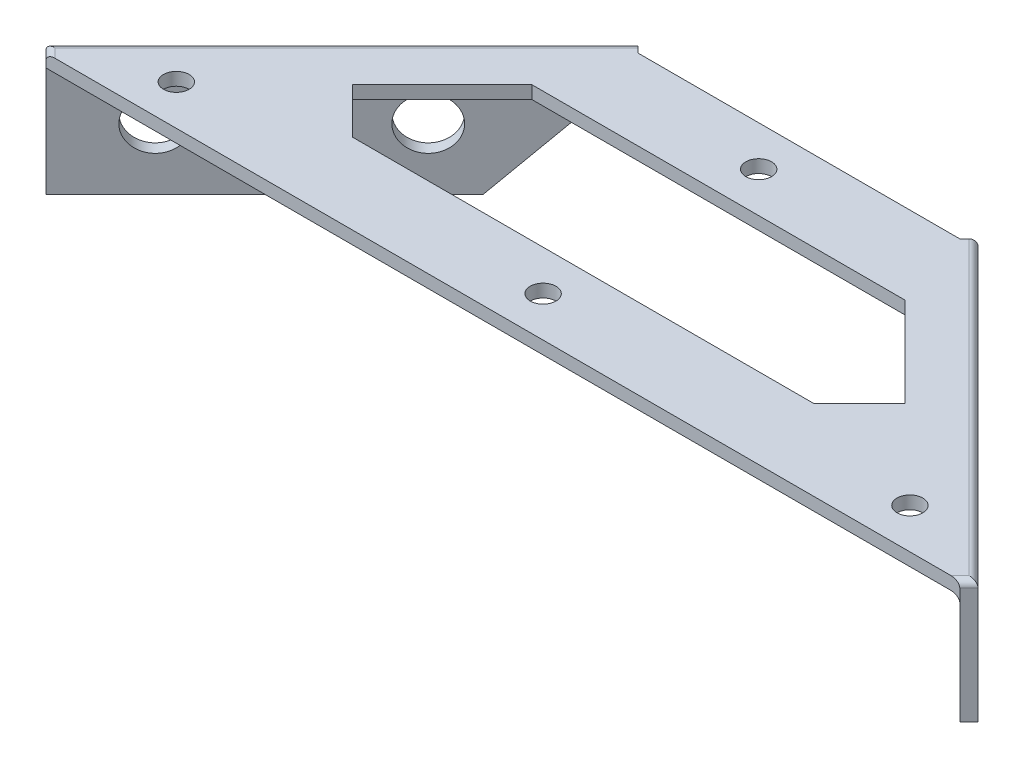
ISO-10303-21;
HEADER;
FILE_DESCRIPTION(('STEP AP214'),'2;1');
FILE_NAME('part.step','',(''),(''),'','','');
FILE_SCHEMA(('AUTOMOTIVE_DESIGN { 1 0 10303 214 1 1 1 1 }'));
ENDSEC;
DATA;
#1=APPLICATION_CONTEXT('core data for automotive mechanical design processes');
#2=APPLICATION_PROTOCOL_DEFINITION('international standard','automotive_design',2000,#1);
#3=PRODUCT_CONTEXT('',#1,'mechanical');
#4=PRODUCT('Part','Part','',(#3));
#5=PRODUCT_RELATED_PRODUCT_CATEGORY('part','',(#4));
#6=PRODUCT_DEFINITION_FORMATION('','',#4);
#7=PRODUCT_DEFINITION_CONTEXT('part definition',#1,'design');
#8=PRODUCT_DEFINITION('design','',#6,#7);
#9=PRODUCT_DEFINITION_SHAPE('','',#8);
#10=(LENGTH_UNIT() NAMED_UNIT(*) SI_UNIT(.MILLI.,.METRE.));
#11=(NAMED_UNIT(*) PLANE_ANGLE_UNIT() SI_UNIT($,.RADIAN.));
#12=(NAMED_UNIT(*) SI_UNIT($,.STERADIAN.) SOLID_ANGLE_UNIT());
#13=UNCERTAINTY_MEASURE_WITH_UNIT(LENGTH_MEASURE(1.E-05),#10,'distance_accuracy_value','');
#14=(GEOMETRIC_REPRESENTATION_CONTEXT(3) GLOBAL_UNCERTAINTY_ASSIGNED_CONTEXT((#13)) GLOBAL_UNIT_ASSIGNED_CONTEXT((#10,
#11,#12)) REPRESENTATION_CONTEXT('',''));
#15=CARTESIAN_POINT('',(0.,0.,0.));
#16=DIRECTION('',(0.,0.,1.));
#17=DIRECTION('',(1.,0.,0.));
#18=AXIS2_PLACEMENT_3D('',#15,#16,#17);
#19=CARTESIAN_POINT('',(24.9999999999995,69.0538238691627,-46.));
#20=DIRECTION('',(-0.707106781186551,0.,-0.707106781186544));
#21=DIRECTION('',(-0.707106781186544,0.,0.707106781186551));
#22=AXIS2_PLACEMENT_3D('',#19,#20,#21);
#23=PLANE('',#22);
#24=DIRECTION('',(0.,-1.,0.));
#25=VECTOR('',#24,1.);
#26=CARTESIAN_POINT('',(26.4142135623726,69.0538238691627,-47.4142135623731));
#27=LINE('',#26,#25);
#28=CARTESIAN_POINT('',(26.4142135623726,1.,-47.4142135623731));
#29=VERTEX_POINT('',#28);
#30=CARTESIAN_POINT('',(26.4142135623726,0.,-47.4142135623731));
#31=VERTEX_POINT('',#30);
#32=EDGE_CURVE('E212',#29,#31,#27,.T.);
#33=ORIENTED_EDGE('',*,*,#32,.T.);
#34=DIRECTION('',(-0.707106781186544,0.,0.707106781186551));
#35=VECTOR('',#34,1.);
#36=CARTESIAN_POINT('',(49.4142135623726,0.,-70.4142135623733));
#37=LINE('',#36,#35);
#38=CARTESIAN_POINT('',(24.9999999999995,0.,-46.));
#39=VERTEX_POINT('',#38);
#40=EDGE_CURVE('E196',#31,#39,#37,.T.);
#41=ORIENTED_EDGE('',*,*,#40,.T.);
#42=DIRECTION('',(0.,-1.,0.));
#43=VECTOR('',#42,1.);
#44=CARTESIAN_POINT('',(24.9999999999995,2.,-46.));
#45=LINE('',#44,#43);
#46=CARTESIAN_POINT('',(24.9999999999995,2.,-46.));
#47=VERTEX_POINT('',#46);
#48=EDGE_CURVE('E265',#47,#39,#45,.T.);
#49=ORIENTED_EDGE('',*,*,#48,.F.);
#50=DIRECTION('',(-0.707106781186544,0.,0.707106781186551));
#51=VECTOR('',#50,1.);
#52=CARTESIAN_POINT('',(24.9999999999995,2.,-46.));
#53=LINE('',#52,#51);
#54=CARTESIAN_POINT('',(25.7071067811861,2.,-46.7071067811865));
#55=VERTEX_POINT('',#54);
#56=EDGE_CURVE('E221',#55,#47,#53,.T.);
#57=ORIENTED_EDGE('',*,*,#56,.F.);
#58=CARTESIAN_POINT('',(25.7071067811861,1.,-46.7071067811866));
#59=DIRECTION('',(-0.707106781186551,0.,-0.707106781186544));
#60=DIRECTION('',(-0.707106781186544,0.,0.707106781186551));
#61=AXIS2_PLACEMENT_3D('',#58,#59,#60);
#62=CIRCLE('',#61,1.);
#63=EDGE_CURVE('E303',#55,#29,#62,.T.);
#64=ORIENTED_EDGE('',*,*,#63,.T.);
#65=EDGE_LOOP('',(#33,#41,#49,#57,#64));
#66=FACE_BOUND('',#65,.T.);
#67=ADVANCED_FACE('F37',(#66),#23,.T.);
#68=CARTESIAN_POINT('',(24.9999999999995,69.0538238691627,-46.));
#69=DIRECTION('',(-0.707106781186544,0.,0.707106781186551));
#70=DIRECTION('',(0.707106781186551,0.,0.707106781186544));
#71=AXIS2_PLACEMENT_3D('',#68,#69,#70);
#72=PLANE('',#71);
#73=CARTESIAN_POINT('',(41.3015151901648,-7.50000000000001,-29.6984848098348));
#74=DIRECTION('',(-0.707106781186544,0.,0.707106781186551));
#75=DIRECTION('',(0.707106781186551,0.,0.707106781186544));
#76=AXIS2_PLACEMENT_3D('',#73,#74,#75);
#77=CIRCLE('',#76,4.);
#78=CARTESIAN_POINT('',(44.129942314911,-7.50000000000001,-26.8700576850887));
#79=VERTEX_POINT('',#78);
#80=EDGE_CURVE('E375',#79,#79,#77,.F.);
#81=ORIENTED_EDGE('',*,*,#80,.T.);
#82=EDGE_LOOP('',(#81));
#83=FACE_BOUND('',#82,.T.);
#84=CARTESIAN_POINT('',(62.5147186257614,-7.5,-8.48528137423854));
#85=DIRECTION('',(-0.707106781186544,0.,0.707106781186551));
#86=DIRECTION('',(0.707106781186551,0.,0.707106781186544));
#87=AXIS2_PLACEMENT_3D('',#84,#85,#86);
#88=CIRCLE('',#87,4.);
#89=CARTESIAN_POINT('',(65.3431457505076,-7.5,-5.65685424949236));
#90=VERTEX_POINT('',#89);
#91=EDGE_CURVE('E372',#90,#90,#88,.F.);
#92=ORIENTED_EDGE('',*,*,#91,.T.);
#93=EDGE_LOOP('',(#92));
#94=FACE_BOUND('',#93,.T.);
#95=DIRECTION('',(-0.707106781186551,0.,-0.707106781186544));
#96=VECTOR('',#95,1.);
#97=CARTESIAN_POINT('',(24.9999999999995,-1.,-46.));
#98=LINE('',#97,#96);
#99=CARTESIAN_POINT('',(71.,-1.,0.));
#100=VERTEX_POINT('',#99);
#101=CARTESIAN_POINT('',(25.7071067811861,-1.,-45.2928932188134));
#102=VERTEX_POINT('',#101);
#103=EDGE_CURVE('E205',#100,#102,#98,.T.);
#104=ORIENTED_EDGE('',*,*,#103,.T.);
#105=DIRECTION('',(0.500000000000005,-0.707106781186544,0.5));
#106=VECTOR('',#105,1.);
#107=CARTESIAN_POINT('',(24.9999999999995,0.,-46.));
#108=LINE('',#107,#106);
#109=CARTESIAN_POINT('',(37.020815280171,-17.,-33.9791847198287));
#110=VERTEX_POINT('',#109);
#111=EDGE_CURVE('E189',#102,#110,#108,.T.);
#112=ORIENTED_EDGE('',*,*,#111,.T.);
#113=DIRECTION('',(-0.707106781186551,0.,-0.707106781186544));
#114=VECTOR('',#113,1.);
#115=CARTESIAN_POINT('',(24.9999999999995,-17.,-46.));
#116=LINE('',#115,#114);
#117=CARTESIAN_POINT('',(71.,-17.,0.));
#118=VERTEX_POINT('',#117);
#119=EDGE_CURVE('E203',#118,#110,#116,.T.);
#120=ORIENTED_EDGE('',*,*,#119,.F.);
#121=DIRECTION('',(0.,-1.,0.));
#122=VECTOR('',#121,1.);
#123=CARTESIAN_POINT('',(71.,69.0538238691627,0.));
#124=LINE('',#123,#122);
#125=EDGE_CURVE('E224',#100,#118,#124,.T.);
#126=ORIENTED_EDGE('',*,*,#125,.F.);
#127=EDGE_LOOP('',(#104,#112,#120,#126));
#128=FACE_BOUND('',#127,.T.);
#129=ADVANCED_FACE('F201',(#83,#94,#128),#72,.T.);
#130=CARTESIAN_POINT('',(26.4142135623726,69.0538238691627,-47.4142135623731));
#131=DIRECTION('',(0.707106781186543,0.,-0.707106781186552));
#132=DIRECTION('',(-0.707106781186552,0.,-0.707106781186543));
#133=AXIS2_PLACEMENT_3D('',#130,#131,#132);
#134=PLANE('',#133);
#135=CARTESIAN_POINT('',(42.7157287525379,-7.50000000000001,-31.112698372208));
#136=DIRECTION('',(-0.707106781186544,0.,0.707106781186551));
#137=DIRECTION('',(0.707106781186551,0.,0.707106781186544));
#138=AXIS2_PLACEMENT_3D('',#135,#136,#137);
#139=CIRCLE('',#138,4.);
#140=CARTESIAN_POINT('',(45.5441558772841,-7.50000000000001,-28.2842712474618));
#141=VERTEX_POINT('',#140);
#142=EDGE_CURVE('E366',#141,#141,#139,.T.);
#143=ORIENTED_EDGE('',*,*,#142,.T.);
#144=EDGE_LOOP('',(#143));
#145=FACE_BOUND('',#144,.T.);
#146=CARTESIAN_POINT('',(63.9289321881345,-7.5,-9.89949493661166));
#147=DIRECTION('',(-0.707106781186544,0.,0.707106781186551));
#148=DIRECTION('',(0.707106781186551,0.,0.707106781186544));
#149=AXIS2_PLACEMENT_3D('',#146,#147,#148);
#150=CIRCLE('',#149,4.);
#151=CARTESIAN_POINT('',(66.7573593128807,-7.5,-7.07106781186549));
#152=VERTEX_POINT('',#151);
#153=EDGE_CURVE('E369',#152,#152,#150,.T.);
#154=ORIENTED_EDGE('',*,*,#153,.T.);
#155=EDGE_LOOP('',(#154));
#156=FACE_BOUND('',#155,.T.);
#157=DIRECTION('',(0.707106781186551,0.,0.707106781186543));
#158=VECTOR('',#157,1.);
#159=CARTESIAN_POINT('',(26.4142135623726,-17.,-47.4142135623731));
#160=LINE('',#159,#158);
#161=CARTESIAN_POINT('',(38.4350288425441,-17.,-35.3933982822017));
#162=VERTEX_POINT('',#161);
#163=CARTESIAN_POINT('',(72.4142135623731,-17.,-1.41421356237312));
#164=VERTEX_POINT('',#163);
#165=EDGE_CURVE('E217',#162,#164,#160,.T.);
#166=ORIENTED_EDGE('',*,*,#165,.F.);
#167=DIRECTION('',(-0.500000000000005,0.707106781186544,-0.5));
#168=VECTOR('',#167,1.);
#169=CARTESIAN_POINT('',(1.99999999999925,34.526911934581,-71.8284271247462));
#170=LINE('',#169,#168);
#171=EDGE_CURVE('E192',#162,#31,#170,.T.);
#172=ORIENTED_EDGE('',*,*,#171,.T.);
#173=ORIENTED_EDGE('',*,*,#32,.F.);
#174=DIRECTION('',(-0.707106781186552,0.,-0.707106781186543));
#175=VECTOR('',#174,1.);
#176=CARTESIAN_POINT('',(72.4142135623731,1.,-1.41421356237313));
#177=LINE('',#176,#175);
#178=CARTESIAN_POINT('',(72.4142135623731,1.,-1.41421356237312));
#179=VERTEX_POINT('',#178);
#180=EDGE_CURVE('E305',#29,#179,#177,.F.);
#181=ORIENTED_EDGE('',*,*,#180,.T.);
#182=DIRECTION('',(0.,-1.,0.));
#183=VECTOR('',#182,1.);
#184=CARTESIAN_POINT('',(72.4142135623731,69.0538238691627,-1.41421356237312));
#185=LINE('',#184,#183);
#186=EDGE_CURVE('E215',#179,#164,#185,.T.);
#187=ORIENTED_EDGE('',*,*,#186,.T.);
#188=EDGE_LOOP('',(#166,#172,#173,#181,#187));
#189=FACE_BOUND('',#188,.T.);
#190=ADVANCED_FACE('F334',(#145,#156,#189),#134,.T.);
#191=CARTESIAN_POINT('',(0.,-17.,0.));
#192=DIRECTION('',(0.,-1.,0.));
#193=DIRECTION('',(0.,0.,-1.));
#194=AXIS2_PLACEMENT_3D('',#191,#192,#193);
#195=PLANE('',#194);
#196=ORIENTED_EDGE('',*,*,#119,.T.);
#197=DIRECTION('',(-0.707106781186544,0.,0.707106781186551));
#198=VECTOR('',#197,1.);
#199=CARTESIAN_POINT('',(61.4350288425441,-17.,-58.393398282202));
#200=LINE('',#199,#198);
#201=EDGE_CURVE('E186',#162,#110,#200,.T.);
#202=ORIENTED_EDGE('',*,*,#201,.F.);
#203=ORIENTED_EDGE('',*,*,#165,.T.);
#204=DIRECTION('',(-0.707106781186557,0.,0.707106781186538));
#205=VECTOR('',#204,1.);
#206=CARTESIAN_POINT('',(71.,-17.,0.));
#207=LINE('',#206,#205);
#208=EDGE_CURVE('E211',#164,#118,#207,.T.);
#209=ORIENTED_EDGE('',*,*,#208,.T.);
#210=EDGE_LOOP('',(#196,#202,#203,#209));
#211=FACE_BOUND('',#210,.T.);
#212=ADVANCED_FACE('F209',(#211),#195,.T.);
#213=CARTESIAN_POINT('',(-71.,2.,0.));
#214=DIRECTION('',(0.,0.,-1.));
#215=DIRECTION('',(-1.,0.,0.));
#216=AXIS2_PLACEMENT_3D('',#213,#214,#215);
#217=PLANE('',#216);
#218=DIRECTION('',(0.,-1.,0.));
#219=VECTOR('',#218,1.);
#220=CARTESIAN_POINT('',(71.,2.,0.));
#221=LINE('',#220,#219);
#222=CARTESIAN_POINT('',(71.,1.,0.));
#223=VERTEX_POINT('',#222);
#224=EDGE_CURVE('E268',#223,#100,#221,.T.);
#225=ORIENTED_EDGE('',*,*,#224,.F.);
#226=CARTESIAN_POINT('',(69.5857864376268,1.,0.));
#227=DIRECTION('',(0.,0.,-1.));
#228=DIRECTION('',(-1.,0.,0.));
#229=AXIS2_PLACEMENT_3D('',#226,#227,#228);
#230=ELLIPSE('',#229,1.41421356237311,1.);
#231=CARTESIAN_POINT('',(69.5857864376268,2.,0.));
#232=VERTEX_POINT('',#231);
#233=EDGE_CURVE('E291',#223,#232,#230,.F.);
#234=ORIENTED_EDGE('',*,*,#233,.T.);
#235=DIRECTION('',(1.,0.,0.));
#236=VECTOR('',#235,1.);
#237=CARTESIAN_POINT('',(-71.,2.,0.));
#238=LINE('',#237,#236);
#239=CARTESIAN_POINT('',(-69.5857864376269,2.,0.));
#240=VERTEX_POINT('',#239);
#241=EDGE_CURVE('E247',#240,#232,#238,.T.);
#242=ORIENTED_EDGE('',*,*,#241,.F.);
#243=CARTESIAN_POINT('',(-69.5857864376269,1.,0.));
#244=DIRECTION('',(0.,0.,-1.));
#245=DIRECTION('',(-1.,0.,0.));
#246=AXIS2_PLACEMENT_3D('',#243,#244,#245);
#247=ELLIPSE('',#246,1.41421356237308,1.);
#248=CARTESIAN_POINT('',(-71.,1.,0.));
#249=VERTEX_POINT('',#248);
#250=EDGE_CURVE('E289',#240,#249,#247,.F.);
#251=ORIENTED_EDGE('',*,*,#250,.T.);
#252=DIRECTION('',(0.,-1.,0.));
#253=VECTOR('',#252,1.);
#254=CARTESIAN_POINT('',(-71.,2.,0.));
#255=LINE('',#254,#253);
#256=CARTESIAN_POINT('',(-71.,0.,0.));
#257=VERTEX_POINT('',#256);
#258=EDGE_CURVE('E253',#249,#257,#255,.T.);
#259=ORIENTED_EDGE('',*,*,#258,.T.);
#260=DIRECTION('',(1.,0.,0.));
#261=VECTOR('',#260,1.);
#262=CARTESIAN_POINT('',(-71.,0.,0.));
#263=LINE('',#262,#261);
#264=CARTESIAN_POINT('',(69.5857864376269,0.,0.));
#265=VERTEX_POINT('',#264);
#266=EDGE_CURVE('E239',#257,#265,#263,.T.);
#267=ORIENTED_EDGE('',*,*,#266,.T.);
#268=CARTESIAN_POINT('',(69.5857864376269,-1.,0.));
#269=DIRECTION('',(0.,0.,-1.));
#270=DIRECTION('',(1.,0.,0.));
#271=AXIS2_PLACEMENT_3D('',#268,#269,#270);
#272=ELLIPSE('',#271,1.4142135623731,1.);
#273=EDGE_CURVE('E45',#265,#100,#272,.T.);
#274=ORIENTED_EDGE('',*,*,#273,.T.);
#275=EDGE_LOOP('',(#225,#234,#242,#251,#259,#267,#274));
#276=FACE_BOUND('',#275,.T.);
#277=ADVANCED_FACE('F343',(#276),#217,.F.);
#278=CARTESIAN_POINT('',(24.9999999999995,2.,-46.));
#279=DIRECTION('',(0.,0.,1.));
#280=DIRECTION('',(1.,0.,0.));
#281=AXIS2_PLACEMENT_3D('',#278,#279,#280);
#282=PLANE('',#281);
#283=ORIENTED_EDGE('',*,*,#48,.T.);
#284=DIRECTION('',(0.,1.,0.));
#285=VECTOR('',#284,1.);
#286=CARTESIAN_POINT('',(24.9999999999995,-17.,-46.));
#287=LINE('',#286,#285);
#288=CARTESIAN_POINT('',(24.9999999999995,-1.,-46.));
#289=VERTEX_POINT('',#288);
#290=EDGE_CURVE('E206',#289,#39,#287,.T.);
#291=ORIENTED_EDGE('',*,*,#290,.F.);
#292=CARTESIAN_POINT('',(23.5857864376264,-1.,-46.));
#293=DIRECTION('',(0.,0.,1.));
#294=DIRECTION('',(1.,0.,0.));
#295=AXIS2_PLACEMENT_3D('',#292,#293,#294);
#296=ELLIPSE('',#295,1.4142135623731,1.);
#297=CARTESIAN_POINT('',(23.5857864376264,0.,-46.));
#298=VERTEX_POINT('',#297);
#299=EDGE_CURVE('E307',#289,#298,#296,.T.);
#300=ORIENTED_EDGE('',*,*,#299,.T.);
#301=DIRECTION('',(-1.,0.,0.));
#302=VECTOR('',#301,1.);
#303=CARTESIAN_POINT('',(24.9999999999995,0.,-46.));
#304=LINE('',#303,#302);
#305=CARTESIAN_POINT('',(-24.9999999999995,0.,-46.));
#306=VERTEX_POINT('',#305);
#307=EDGE_CURVE('E256',#298,#306,#304,.T.);
#308=ORIENTED_EDGE('',*,*,#307,.T.);
#309=DIRECTION('',(0.,-1.,0.));
#310=VECTOR('',#309,1.);
#311=CARTESIAN_POINT('',(-24.9999999999995,2.,-46.));
#312=LINE('',#311,#310);
#313=CARTESIAN_POINT('',(-24.9999999999995,2.,-46.));
#314=VERTEX_POINT('',#313);
#315=EDGE_CURVE('E262',#314,#306,#312,.T.);
#316=ORIENTED_EDGE('',*,*,#315,.F.);
#317=DIRECTION('',(-1.,0.,0.));
#318=VECTOR('',#317,1.);
#319=CARTESIAN_POINT('',(24.9999999999995,2.,-46.));
#320=LINE('',#319,#318);
#321=EDGE_CURVE('E250',#47,#314,#320,.T.);
#322=ORIENTED_EDGE('',*,*,#321,.F.);
#323=EDGE_LOOP('',(#283,#291,#300,#308,#316,#322));
#324=FACE_BOUND('',#323,.T.);
#325=ADVANCED_FACE('F352',(#324),#282,.F.);
#326=CARTESIAN_POINT('',(0.,2.,0.));
#327=DIRECTION('',(0.,-1.,0.));
#328=DIRECTION('',(0.,0.,-1.));
#329=AXIS2_PLACEMENT_3D('',#326,#327,#328);
#330=PLANE('',#329);
#331=CARTESIAN_POINT('',(-57.,2.,-6.24999999999999));
#332=DIRECTION('',(0.,-1.,0.));
#333=DIRECTION('',(0.,0.,1.));
#334=AXIS2_PLACEMENT_3D('',#331,#332,#333);
#335=CIRCLE('',#334,2.00000000000001);
#336=CARTESIAN_POINT('',(-57.,2.,-4.24999999999998));
#337=VERTEX_POINT('',#336);
#338=EDGE_CURVE('E794',#337,#337,#335,.T.);
#339=ORIENTED_EDGE('',*,*,#338,.T.);
#340=EDGE_LOOP('',(#339));
#341=FACE_BOUND('',#340,.T.);
#342=CARTESIAN_POINT('',(57.,2.,-6.25000000000001));
#343=DIRECTION('',(0.,-1.,0.));
#344=DIRECTION('',(0.,0.,-1.));
#345=AXIS2_PLACEMENT_3D('',#342,#343,#344);
#346=CIRCLE('',#345,2.);
#347=CARTESIAN_POINT('',(57.,2.,-8.25000000000001));
#348=VERTEX_POINT('',#347);
#349=EDGE_CURVE('E803',#348,#348,#346,.T.);
#350=ORIENTED_EDGE('',*,*,#349,.T.);
#351=EDGE_LOOP('',(#350));
#352=FACE_BOUND('',#351,.T.);
#353=CARTESIAN_POINT('',(0.,2.,-39.75));
#354=DIRECTION('',(0.,-1.,0.));
#355=DIRECTION('',(0.,0.,-1.));
#356=AXIS2_PLACEMENT_3D('',#353,#354,#355);
#357=CIRCLE('',#356,2.);
#358=CARTESIAN_POINT('',(0.,2.,-41.75));
#359=VERTEX_POINT('',#358);
#360=EDGE_CURVE('E809',#359,#359,#357,.T.);
#361=ORIENTED_EDGE('',*,*,#360,.T.);
#362=EDGE_LOOP('',(#361));
#363=FACE_BOUND('',#362,.T.);
#364=CARTESIAN_POINT('',(0.,2.,-6.25000000000002));
#365=DIRECTION('',(0.,-1.,0.));
#366=DIRECTION('',(0.,0.,-1.));
#367=AXIS2_PLACEMENT_3D('',#364,#365,#366);
#368=CIRCLE('',#367,2.);
#369=CARTESIAN_POINT('',(0.,2.,-8.25000000000002));
#370=VERTEX_POINT('',#369);
#371=EDGE_CURVE('E356',#370,#370,#368,.T.);
#372=ORIENTED_EDGE('',*,*,#371,.T.);
#373=EDGE_LOOP('',(#372));
#374=FACE_BOUND('',#373,.T.);
#375=DIRECTION('',(-1.,0.,0.));
#376=VECTOR('',#375,1.);
#377=CARTESIAN_POINT('',(0.,2.,-12.5));
#378=LINE('',#377,#376);
#379=CARTESIAN_POINT('',(35.8725830020301,2.,-12.5));
#380=VERTEX_POINT('',#379);
#381=CARTESIAN_POINT('',(-35.8725830020301,2.,-12.5));
#382=VERTEX_POINT('',#381);
#383=EDGE_CURVE('E391',#380,#382,#378,.T.);
#384=ORIENTED_EDGE('',*,*,#383,.T.);
#385=DIRECTION('',(-0.707106781186546,0.,-0.707106781186549));
#386=VECTOR('',#385,1.);
#387=CARTESIAN_POINT('',(-11.6862915010151,2.,11.6862915010151));
#388=LINE('',#387,#386);
#389=CARTESIAN_POINT('',(-42.9436508138956,2.,-19.5710678118655));
#390=VERTEX_POINT('',#389);
#391=EDGE_CURVE('E379',#382,#390,#388,.T.);
#392=ORIENTED_EDGE('',*,*,#391,.T.);
#393=DIRECTION('',(0.707106781186548,0.,-0.707106781186547));
#394=VECTOR('',#393,1.);
#395=CARTESIAN_POINT('',(-31.2573593128805,2.,-31.2573593128805));
#396=LINE('',#395,#394);
#397=CARTESIAN_POINT('',(-29.0147186257611,2.,-33.5));
#398=VERTEX_POINT('',#397);
#399=EDGE_CURVE('E382',#390,#398,#396,.T.);
#400=ORIENTED_EDGE('',*,*,#399,.T.);
#401=DIRECTION('',(1.,0.,0.));
#402=VECTOR('',#401,1.);
#403=CARTESIAN_POINT('',(0.,2.,-33.5));
#404=LINE('',#403,#402);
#405=CARTESIAN_POINT('',(29.014718625761,2.,-33.5));
#406=VERTEX_POINT('',#405);
#407=EDGE_CURVE('E60',#398,#406,#404,.T.);
#408=ORIENTED_EDGE('',*,*,#407,.T.);
#409=DIRECTION('',(-0.707106781186548,0.,-0.707106781186547));
#410=VECTOR('',#409,1.);
#411=CARTESIAN_POINT('',(31.2573593128805,2.,-31.2573593128805));
#412=LINE('',#411,#410);
#413=CARTESIAN_POINT('',(42.9436508138956,2.,-19.5710678118655));
#414=VERTEX_POINT('',#413);
#415=EDGE_CURVE('E387',#414,#406,#412,.T.);
#416=ORIENTED_EDGE('',*,*,#415,.F.);
#417=DIRECTION('',(0.707106781186546,0.,-0.707106781186549));
#418=VECTOR('',#417,1.);
#419=CARTESIAN_POINT('',(11.6862915010151,2.,11.6862915010151));
#420=LINE('',#419,#418);
#421=EDGE_CURVE('E389',#380,#414,#420,.T.);
#422=ORIENTED_EDGE('',*,*,#421,.F.);
#423=EDGE_LOOP('',(#384,#392,#400,#408,#416,#422));
#424=FACE_BOUND('',#423,.T.);
#425=DIRECTION('',(-0.707106781186551,0.,0.707106781186544));
#426=VECTOR('',#425,1.);
#427=CARTESIAN_POINT('',(-71.7071067811865,2.,-0.707106781186552));
#428=LINE('',#427,#426);
#429=CARTESIAN_POINT('',(-25.7071067811861,2.,-46.7071067811865));
#430=VERTEX_POINT('',#429);
#431=CARTESIAN_POINT('',(-71.,2.,-1.41421356237309));
#432=VERTEX_POINT('',#431);
#433=EDGE_CURVE('E282',#430,#432,#428,.T.);
#434=ORIENTED_EDGE('',*,*,#433,.T.);
#435=DIRECTION('',(0.707106781186539,0.,0.707106781186556));
#436=VECTOR('',#435,1.);
#437=CARTESIAN_POINT('',(-70.2928932188134,2.,-0.707106781186538));
#438=LINE('',#437,#436);
#439=EDGE_CURVE('E284',#432,#240,#438,.T.);
#440=ORIENTED_EDGE('',*,*,#439,.T.);
#441=ORIENTED_EDGE('',*,*,#241,.T.);
#442=DIRECTION('',(0.707106781186557,0.,-0.707106781186538));
#443=VECTOR('',#442,1.);
#444=CARTESIAN_POINT('',(71.7071067811866,2.,-2.12132034355969));
#445=LINE('',#444,#443);
#446=CARTESIAN_POINT('',(71.,2.,-1.41421356237314));
#447=VERTEX_POINT('',#446);
#448=EDGE_CURVE('E279',#232,#447,#445,.T.);
#449=ORIENTED_EDGE('',*,*,#448,.T.);
#450=DIRECTION('',(-0.707106781186552,0.,-0.707106781186543));
#451=VECTOR('',#450,1.);
#452=CARTESIAN_POINT('',(25.7071067811861,2.,-46.7071067811865));
#453=LINE('',#452,#451);
#454=EDGE_CURVE('E270',#447,#55,#453,.T.);
#455=ORIENTED_EDGE('',*,*,#454,.T.);
#456=ORIENTED_EDGE('',*,*,#56,.T.);
#457=ORIENTED_EDGE('',*,*,#321,.T.);
#458=DIRECTION('',(-0.707106781186543,0.,-0.707106781186552));
#459=VECTOR('',#458,1.);
#460=CARTESIAN_POINT('',(-24.9999999999995,2.,-46.));
#461=LINE('',#460,#459);
#462=EDGE_CURVE('E236',#314,#430,#461,.T.);
#463=ORIENTED_EDGE('',*,*,#462,.T.);
#464=EDGE_LOOP('',(#434,#440,#441,#449,#455,#456,#457,#463));
#465=FACE_BOUND('',#464,.T.);
#466=ADVANCED_FACE('F450',(#341,#352,#363,#374,#424,#465),#330,.F.);
#467=CARTESIAN_POINT('',(0.,0.,0.));
#468=DIRECTION('',(0.,-1.,0.));
#469=DIRECTION('',(0.,0.,-1.));
#470=AXIS2_PLACEMENT_3D('',#467,#468,#469);
#471=PLANE('',#470);
#472=CARTESIAN_POINT('',(-57.,0.,-6.24999999999999));
#473=DIRECTION('',(0.,-1.,0.));
#474=DIRECTION('',(0.,0.,1.));
#475=AXIS2_PLACEMENT_3D('',#472,#473,#474);
#476=CIRCLE('',#475,2.00000000000001);
#477=CARTESIAN_POINT('',(-57.,0.,-4.24999999999998));
#478=VERTEX_POINT('',#477);
#479=EDGE_CURVE('E796',#478,#478,#476,.T.);
#480=ORIENTED_EDGE('',*,*,#479,.F.);
#481=EDGE_LOOP('',(#480));
#482=FACE_BOUND('',#481,.T.);
#483=CARTESIAN_POINT('',(57.,0.,-6.25000000000001));
#484=DIRECTION('',(0.,-1.,0.));
#485=DIRECTION('',(0.,0.,-1.));
#486=AXIS2_PLACEMENT_3D('',#483,#484,#485);
#487=CIRCLE('',#486,2.);
#488=CARTESIAN_POINT('',(57.,0.,-8.25000000000001));
#489=VERTEX_POINT('',#488);
#490=EDGE_CURVE('E798',#489,#489,#487,.T.);
#491=ORIENTED_EDGE('',*,*,#490,.F.);
#492=EDGE_LOOP('',(#491));
#493=FACE_BOUND('',#492,.T.);
#494=CARTESIAN_POINT('',(0.,0.,-39.75));
#495=DIRECTION('',(0.,-1.,0.));
#496=DIRECTION('',(0.,0.,-1.));
#497=AXIS2_PLACEMENT_3D('',#494,#495,#496);
#498=CIRCLE('',#497,2.);
#499=CARTESIAN_POINT('',(0.,0.,-41.75));
#500=VERTEX_POINT('',#499);
#501=EDGE_CURVE('E806',#500,#500,#498,.T.);
#502=ORIENTED_EDGE('',*,*,#501,.F.);
#503=EDGE_LOOP('',(#502));
#504=FACE_BOUND('',#503,.T.);
#505=CARTESIAN_POINT('',(0.,0.,-6.25000000000002));
#506=DIRECTION('',(0.,-1.,0.));
#507=DIRECTION('',(0.,0.,-1.));
#508=AXIS2_PLACEMENT_3D('',#505,#506,#507);
#509=CIRCLE('',#508,2.);
#510=CARTESIAN_POINT('',(0.,0.,-8.25000000000002));
#511=VERTEX_POINT('',#510);
#512=EDGE_CURVE('E359',#511,#511,#509,.T.);
#513=ORIENTED_EDGE('',*,*,#512,.F.);
#514=EDGE_LOOP('',(#513));
#515=FACE_BOUND('',#514,.T.);
#516=DIRECTION('',(-0.707106781186546,0.,-0.707106781186549));
#517=VECTOR('',#516,1.);
#518=CARTESIAN_POINT('',(-11.6862915010151,0.,11.6862915010151));
#519=LINE('',#518,#517);
#520=CARTESIAN_POINT('',(-35.8725830020301,0.,-12.5));
#521=VERTEX_POINT('',#520);
#522=CARTESIAN_POINT('',(-42.9436508138956,0.,-19.5710678118655));
#523=VERTEX_POINT('',#522);
#524=EDGE_CURVE('E378',#521,#523,#519,.T.);
#525=ORIENTED_EDGE('',*,*,#524,.F.);
#526=DIRECTION('',(-1.,0.,0.));
#527=VECTOR('',#526,1.);
#528=CARTESIAN_POINT('',(0.,0.,-12.5));
#529=LINE('',#528,#527);
#530=CARTESIAN_POINT('',(35.8725830020301,0.,-12.5));
#531=VERTEX_POINT('',#530);
#532=EDGE_CURVE('E383',#531,#521,#529,.T.);
#533=ORIENTED_EDGE('',*,*,#532,.F.);
#534=DIRECTION('',(0.707106781186546,0.,-0.707106781186549));
#535=VECTOR('',#534,1.);
#536=CARTESIAN_POINT('',(11.6862915010151,0.,11.6862915010151));
#537=LINE('',#536,#535);
#538=CARTESIAN_POINT('',(42.9436508138956,0.,-19.5710678118655));
#539=VERTEX_POINT('',#538);
#540=EDGE_CURVE('E405',#531,#539,#537,.T.);
#541=ORIENTED_EDGE('',*,*,#540,.T.);
#542=DIRECTION('',(-0.707106781186548,0.,-0.707106781186547));
#543=VECTOR('',#542,1.);
#544=CARTESIAN_POINT('',(31.2573593128805,0.,-31.2573593128805));
#545=LINE('',#544,#543);
#546=CARTESIAN_POINT('',(29.014718625761,0.,-33.5));
#547=VERTEX_POINT('',#546);
#548=EDGE_CURVE('E402',#539,#547,#545,.T.);
#549=ORIENTED_EDGE('',*,*,#548,.T.);
#550=DIRECTION('',(1.,0.,0.));
#551=VECTOR('',#550,1.);
#552=CARTESIAN_POINT('',(0.,0.,-33.5));
#553=LINE('',#552,#551);
#554=CARTESIAN_POINT('',(-29.0147186257611,0.,-33.5));
#555=VERTEX_POINT('',#554);
#556=EDGE_CURVE('E399',#555,#547,#553,.T.);
#557=ORIENTED_EDGE('',*,*,#556,.F.);
#558=DIRECTION('',(0.707106781186548,0.,-0.707106781186547));
#559=VECTOR('',#558,1.);
#560=CARTESIAN_POINT('',(-31.2573593128805,0.,-31.2573593128805));
#561=LINE('',#560,#559);
#562=EDGE_CURVE('E396',#523,#555,#561,.T.);
#563=ORIENTED_EDGE('',*,*,#562,.F.);
#564=EDGE_LOOP('',(#525,#533,#541,#549,#557,#563));
#565=FACE_BOUND('',#564,.T.);
#566=ORIENTED_EDGE('',*,*,#307,.F.);
#567=DIRECTION('',(-0.707106781186551,0.,-0.707106781186544));
#568=VECTOR('',#567,1.);
#569=CARTESIAN_POINT('',(70.2928932188135,0.,0.707106781186559));
#570=LINE('',#569,#568);
#571=EDGE_CURVE('E301',#298,#265,#570,.F.);
#572=ORIENTED_EDGE('',*,*,#571,.T.);
#573=ORIENTED_EDGE('',*,*,#266,.F.);
#574=DIRECTION('',(-0.707106781186551,0.,0.707106781186544));
#575=VECTOR('',#574,1.);
#576=CARTESIAN_POINT('',(-24.9999999999995,0.,-46.));
#577=LINE('',#576,#575);
#578=EDGE_CURVE('E251',#306,#257,#577,.T.);
#579=ORIENTED_EDGE('',*,*,#578,.F.);
#580=EDGE_LOOP('',(#566,#572,#573,#579));
#581=FACE_BOUND('',#580,.T.);
#582=ADVANCED_FACE('F454',(#482,#493,#504,#515,#565,#581),#471,.T.);
#583=CARTESIAN_POINT('',(-24.9999999999995,69.0538238691627,-46.));
#584=DIRECTION('',(0.707106781186552,0.,-0.707106781186543));
#585=DIRECTION('',(-0.707106781186543,0.,-0.707106781186552));
#586=AXIS2_PLACEMENT_3D('',#583,#584,#585);
#587=PLANE('',#586);
#588=DIRECTION('',(0.707106781186544,0.,0.707106781186551));
#589=VECTOR('',#588,1.);
#590=CARTESIAN_POINT('',(-49.4142135623726,0.,-70.4142135623733));
#591=LINE('',#590,#589);
#592=CARTESIAN_POINT('',(-26.4142135623726,0.,-47.4142135623731));
#593=VERTEX_POINT('',#592);
#594=EDGE_CURVE('E320',#593,#306,#591,.T.);
#595=ORIENTED_EDGE('',*,*,#594,.F.);
#596=DIRECTION('',(0.,-1.,0.));
#597=VECTOR('',#596,1.);
#598=CARTESIAN_POINT('',(-26.4142135623726,69.0538238691627,-47.4142135623731));
#599=LINE('',#598,#597);
#600=CARTESIAN_POINT('',(-26.4142135623726,1.,-47.4142135623731));
#601=VERTEX_POINT('',#600);
#602=EDGE_CURVE('E240',#601,#593,#599,.T.);
#603=ORIENTED_EDGE('',*,*,#602,.F.);
#604=CARTESIAN_POINT('',(-25.7071067811861,1.,-46.7071067811865));
#605=DIRECTION('',(0.707106781186552,0.,-0.707106781186543));
#606=DIRECTION('',(-0.707106781186543,0.,-0.707106781186552));
#607=AXIS2_PLACEMENT_3D('',#604,#605,#606);
#608=CIRCLE('',#607,1.);
#609=EDGE_CURVE('E297',#601,#430,#608,.T.);
#610=ORIENTED_EDGE('',*,*,#609,.T.);
#611=ORIENTED_EDGE('',*,*,#462,.F.);
#612=ORIENTED_EDGE('',*,*,#315,.T.);
#613=EDGE_LOOP('',(#595,#603,#610,#611,#612));
#614=FACE_BOUND('',#613,.T.);
#615=ADVANCED_FACE('F444',(#614),#587,.T.);
#616=CARTESIAN_POINT('',(-26.4142135623726,69.0538238691627,-47.4142135623731));
#617=DIRECTION('',(-0.707106781186544,0.,-0.707106781186551));
#618=DIRECTION('',(-0.707106781186551,0.,0.707106781186544));
#619=AXIS2_PLACEMENT_3D('',#616,#617,#618);
#620=PLANE('',#619);
#621=DIRECTION('',(0.500000000000005,0.707106781186544,-0.5));
#622=VECTOR('',#621,1.);
#623=CARTESIAN_POINT('',(-1.99999999999927,34.526911934581,-71.8284271247462));
#624=LINE('',#623,#622);
#625=CARTESIAN_POINT('',(-38.4350288425441,-17.,-35.3933982822017));
#626=VERTEX_POINT('',#625);
#627=EDGE_CURVE('E315',#626,#593,#624,.T.);
#628=ORIENTED_EDGE('',*,*,#627,.F.);
#629=DIRECTION('',(0.707106781186551,0.,-0.707106781186544));
#630=VECTOR('',#629,1.);
#631=CARTESIAN_POINT('',(-26.4142135623726,-17.,-47.4142135623731));
#632=LINE('',#631,#630);
#633=CARTESIAN_POINT('',(-72.4142135623731,-17.,-1.41421356237311));
#634=VERTEX_POINT('',#633);
#635=EDGE_CURVE('E232',#634,#626,#632,.T.);
#636=ORIENTED_EDGE('',*,*,#635,.F.);
#637=DIRECTION('',(0.,-1.,0.));
#638=VECTOR('',#637,1.);
#639=CARTESIAN_POINT('',(-72.4142135623731,69.0538238691627,-1.41421356237311));
#640=LINE('',#639,#638);
#641=CARTESIAN_POINT('',(-72.4142135623731,1.,-1.41421356237311));
#642=VERTEX_POINT('',#641);
#643=EDGE_CURVE('E243',#642,#634,#640,.T.);
#644=ORIENTED_EDGE('',*,*,#643,.F.);
#645=DIRECTION('',(-0.707106781186551,0.,0.707106781186544));
#646=VECTOR('',#645,1.);
#647=CARTESIAN_POINT('',(-26.4142135623726,1.,-47.4142135623731));
#648=LINE('',#647,#646);
#649=EDGE_CURVE('E295',#642,#601,#648,.F.);
#650=ORIENTED_EDGE('',*,*,#649,.T.);
#651=ORIENTED_EDGE('',*,*,#602,.T.);
#652=EDGE_LOOP('',(#628,#636,#644,#650,#651));
#653=FACE_BOUND('',#652,.T.);
#654=CARTESIAN_POINT('',(-42.7157287525379,-7.50000000000001,-31.112698372208));
#655=DIRECTION('',(-0.707106781186544,0.,-0.707106781186551));
#656=DIRECTION('',(-0.707106781186551,0.,0.707106781186544));
#657=AXIS2_PLACEMENT_3D('',#654,#655,#656);
#658=CIRCLE('',#657,4.);
#659=CARTESIAN_POINT('',(-45.5441558772841,-7.50000000000001,-28.2842712474618));
#660=VERTEX_POINT('',#659);
#661=EDGE_CURVE('E312',#660,#660,#658,.T.);
#662=ORIENTED_EDGE('',*,*,#661,.F.);
#663=EDGE_LOOP('',(#662));
#664=FACE_BOUND('',#663,.T.);
#665=CARTESIAN_POINT('',(-63.9289321881345,-7.5,-9.89949493661164));
#666=DIRECTION('',(-0.707106781186544,0.,-0.707106781186551));
#667=DIRECTION('',(-0.707106781186551,0.,0.707106781186544));
#668=AXIS2_PLACEMENT_3D('',#665,#666,#667);
#669=CIRCLE('',#668,4.);
#670=CARTESIAN_POINT('',(-66.7573593128807,-7.5,-7.07106781186546));
#671=VERTEX_POINT('',#670);
#672=EDGE_CURVE('E275',#671,#671,#669,.T.);
#673=ORIENTED_EDGE('',*,*,#672,.F.);
#674=EDGE_LOOP('',(#673));
#675=FACE_BOUND('',#674,.T.);
#676=ADVANCED_FACE('F438',(#653,#664,#675),#620,.T.);
#677=CARTESIAN_POINT('',(-71.,69.0538238691627,0.));
#678=DIRECTION('',(-0.707106781186556,0.,0.707106781186539));
#679=DIRECTION('',(0.707106781186539,0.,0.707106781186556));
#680=AXIS2_PLACEMENT_3D('',#677,#678,#679);
#681=PLANE('',#680);
#682=ORIENTED_EDGE('',*,*,#258,.F.);
#683=DIRECTION('',(0.707106781186539,0.,0.707106781186556));
#684=VECTOR('',#683,1.);
#685=CARTESIAN_POINT('',(-72.4142135623731,1.,-1.41421356237312));
#686=LINE('',#685,#684);
#687=EDGE_CURVE('E293',#249,#642,#686,.F.);
#688=ORIENTED_EDGE('',*,*,#687,.T.);
#689=ORIENTED_EDGE('',*,*,#643,.T.);
#690=DIRECTION('',(-0.707106781186539,0.,-0.707106781186556));
#691=VECTOR('',#690,1.);
#692=CARTESIAN_POINT('',(-71.,-17.,0.));
#693=LINE('',#692,#691);
#694=CARTESIAN_POINT('',(-71.,-17.,0.));
#695=VERTEX_POINT('',#694);
#696=EDGE_CURVE('E229',#695,#634,#693,.T.);
#697=ORIENTED_EDGE('',*,*,#696,.F.);
#698=DIRECTION('',(0.,-1.,0.));
#699=VECTOR('',#698,1.);
#700=CARTESIAN_POINT('',(-71.,69.0538238691627,0.));
#701=LINE('',#700,#699);
#702=EDGE_CURVE('E235',#257,#695,#701,.T.);
#703=ORIENTED_EDGE('',*,*,#702,.F.);
#704=EDGE_LOOP('',(#682,#688,#689,#697,#703));
#705=FACE_BOUND('',#704,.T.);
#706=ADVANCED_FACE('F435',(#705),#681,.T.);
#707=CARTESIAN_POINT('',(-24.9999999999995,69.0538238691627,-46.));
#708=DIRECTION('',(0.707106781186544,0.,0.707106781186551));
#709=DIRECTION('',(0.707106781186551,0.,-0.707106781186544));
#710=AXIS2_PLACEMENT_3D('',#707,#708,#709);
#711=PLANE('',#710);
#712=DIRECTION('',(-0.500000000000005,-0.707106781186544,0.5));
#713=VECTOR('',#712,1.);
#714=CARTESIAN_POINT('',(-24.9999999999995,0.,-46.));
#715=LINE('',#714,#713);
#716=CARTESIAN_POINT('',(-37.020815280171,-17.,-33.9791847198286));
#717=VERTEX_POINT('',#716);
#718=EDGE_CURVE('E325',#306,#717,#715,.T.);
#719=ORIENTED_EDGE('',*,*,#718,.F.);
#720=ORIENTED_EDGE('',*,*,#578,.T.);
#721=ORIENTED_EDGE('',*,*,#702,.T.);
#722=DIRECTION('',(-0.707106781186551,0.,0.707106781186544));
#723=VECTOR('',#722,1.);
#724=CARTESIAN_POINT('',(-24.9999999999995,-17.,-46.));
#725=LINE('',#724,#723);
#726=EDGE_CURVE('E223',#717,#695,#725,.T.);
#727=ORIENTED_EDGE('',*,*,#726,.F.);
#728=EDGE_LOOP('',(#719,#720,#721,#727));
#729=FACE_BOUND('',#728,.T.);
#730=CARTESIAN_POINT('',(-41.3015151901648,-7.50000000000001,-29.6984848098348));
#731=DIRECTION('',(0.707106781186544,0.,0.707106781186551));
#732=DIRECTION('',(0.707106781186551,0.,-0.707106781186544));
#733=AXIS2_PLACEMENT_3D('',#730,#731,#732);
#734=CIRCLE('',#733,4.);
#735=CARTESIAN_POINT('',(-38.4730880654186,-7.50000000000001,-32.526911934581));
#736=VERTEX_POINT('',#735);
#737=EDGE_CURVE('E274',#736,#736,#734,.T.);
#738=ORIENTED_EDGE('',*,*,#737,.F.);
#739=EDGE_LOOP('',(#738));
#740=FACE_BOUND('',#739,.T.);
#741=CARTESIAN_POINT('',(-62.5147186257614,-7.5,-8.48528137423853));
#742=DIRECTION('',(0.707106781186544,0.,0.707106781186551));
#743=DIRECTION('',(0.707106781186551,0.,-0.707106781186544));
#744=AXIS2_PLACEMENT_3D('',#741,#742,#743);
#745=CIRCLE('',#744,4.);
#746=CARTESIAN_POINT('',(-59.6862915010152,-7.5,-11.3137084989847));
#747=VERTEX_POINT('',#746);
#748=EDGE_CURVE('E271',#747,#747,#745,.T.);
#749=ORIENTED_EDGE('',*,*,#748,.F.);
#750=EDGE_LOOP('',(#749));
#751=FACE_BOUND('',#750,.T.);
#752=ADVANCED_FACE('F428',(#729,#740,#751),#711,.T.);
#753=CARTESIAN_POINT('',(0.,-17.,0.));
#754=DIRECTION('',(0.,1.,0.));
#755=DIRECTION('',(0.,0.,1.));
#756=AXIS2_PLACEMENT_3D('',#753,#754,#755);
#757=PLANE('',#756);
#758=ORIENTED_EDGE('',*,*,#635,.T.);
#759=DIRECTION('',(0.707106781186544,0.,0.707106781186551));
#760=VECTOR('',#759,1.);
#761=CARTESIAN_POINT('',(-1.52081528017138,-17.,1.52081528017137));
#762=LINE('',#761,#760);
#763=EDGE_CURVE('E11',#626,#717,#762,.T.);
#764=ORIENTED_EDGE('',*,*,#763,.T.);
#765=ORIENTED_EDGE('',*,*,#726,.T.);
#766=ORIENTED_EDGE('',*,*,#696,.T.);
#767=EDGE_LOOP('',(#758,#764,#765,#766));
#768=FACE_BOUND('',#767,.T.);
#769=ADVANCED_FACE('F426',(#768),#757,.F.);
#770=CARTESIAN_POINT('',(71.,69.0538238691627,0.));
#771=DIRECTION('',(0.707106781186538,0.,0.707106781186557));
#772=DIRECTION('',(0.707106781186557,0.,-0.707106781186538));
#773=AXIS2_PLACEMENT_3D('',#770,#771,#772);
#774=PLANE('',#773);
#775=ORIENTED_EDGE('',*,*,#186,.F.);
#776=DIRECTION('',(0.707106781186557,0.,-0.707106781186538));
#777=VECTOR('',#776,1.);
#778=CARTESIAN_POINT('',(71.,1.,0.));
#779=LINE('',#778,#777);
#780=EDGE_CURVE('E287',#179,#223,#779,.F.);
#781=ORIENTED_EDGE('',*,*,#780,.T.);
#782=ORIENTED_EDGE('',*,*,#224,.T.);
#783=ORIENTED_EDGE('',*,*,#125,.T.);
#784=ORIENTED_EDGE('',*,*,#208,.F.);
#785=EDGE_LOOP('',(#775,#781,#782,#783,#784));
#786=FACE_BOUND('',#785,.T.);
#787=ADVANCED_FACE('F339',(#786),#774,.T.);
#788=CARTESIAN_POINT('',(9.19238815542442,-7.5,63.221825406948));
#789=DIRECTION('',(-0.707106781186544,0.,-0.707106781186551));
#790=DIRECTION('',(-0.707106781186551,0.,0.707106781186544));
#791=AXIS2_PLACEMENT_3D('',#788,#789,#790);
#792=CYLINDRICAL_SURFACE('',#791,4.);
#793=ORIENTED_EDGE('',*,*,#748,.T.);
#794=EDGE_LOOP('',(#793));
#795=FACE_BOUND('',#794,.T.);
#796=ORIENTED_EDGE('',*,*,#672,.T.);
#797=EDGE_LOOP('',(#796));
#798=FACE_BOUND('',#797,.T.);
#799=ADVANCED_FACE('F502',(#795,#798),#792,.F.);
#800=CARTESIAN_POINT('',(30.405591591021,-7.50000000000001,42.0086219713517));
#801=DIRECTION('',(-0.707106781186544,0.,-0.707106781186551));
#802=DIRECTION('',(-0.707106781186551,0.,0.707106781186544));
#803=AXIS2_PLACEMENT_3D('',#800,#801,#802);
#804=CYLINDRICAL_SURFACE('',#803,4.);
#805=ORIENTED_EDGE('',*,*,#737,.T.);
#806=EDGE_LOOP('',(#805));
#807=FACE_BOUND('',#806,.T.);
#808=ORIENTED_EDGE('',*,*,#661,.T.);
#809=EDGE_LOOP('',(#808));
#810=FACE_BOUND('',#809,.T.);
#811=ADVANCED_FACE('F509',(#807,#810),#804,.F.);
#812=CARTESIAN_POINT('',(36.2071067811862,1.,-36.2071067811866));
#813=DIRECTION('',(0.707106781186552,0.,0.707106781186543));
#814=DIRECTION('',(0.707106781186543,0.,-0.707106781186552));
#815=AXIS2_PLACEMENT_3D('',#812,#813,#814);
#816=CYLINDRICAL_SURFACE('',#815,1.);
#817=ORIENTED_EDGE('',*,*,#63,.F.);
#818=ORIENTED_EDGE('',*,*,#454,.F.);
#819=CARTESIAN_POINT('',(71.,1.,-1.41421356237314));
#820=DIRECTION('',(0.,0.,1.));
#821=DIRECTION('',(1.,0.,0.));
#822=AXIS2_PLACEMENT_3D('',#819,#820,#821);
#823=ELLIPSE('',#822,1.41421356237311,1.);
#824=EDGE_CURVE('E311',#179,#447,#823,.T.);
#825=ORIENTED_EDGE('',*,*,#824,.F.);
#826=ORIENTED_EDGE('',*,*,#180,.F.);
#827=EDGE_LOOP('',(#817,#818,#825,#826));
#828=FACE_BOUND('',#827,.T.);
#829=ADVANCED_FACE('F517',(#828),#816,.T.);
#830=CARTESIAN_POINT('',(34.7928932188125,1.,34.7928932188134));
#831=DIRECTION('',(-0.707106781186557,0.,0.707106781186538));
#832=DIRECTION('',(0.707106781186538,0.,0.707106781186557));
#833=AXIS2_PLACEMENT_3D('',#830,#831,#832);
#834=CYLINDRICAL_SURFACE('',#833,1.);
#835=ORIENTED_EDGE('',*,*,#233,.F.);
#836=ORIENTED_EDGE('',*,*,#780,.F.);
#837=ORIENTED_EDGE('',*,*,#824,.T.);
#838=ORIENTED_EDGE('',*,*,#448,.F.);
#839=EDGE_LOOP('',(#835,#836,#837,#838));
#840=FACE_BOUND('',#839,.T.);
#841=ADVANCED_FACE('F525',(#840),#834,.T.);
#842=CARTESIAN_POINT('',(-36.2071067811862,1.,-36.2071067811865));
#843=DIRECTION('',(0.707106781186551,0.,-0.707106781186544));
#844=DIRECTION('',(-0.707106781186544,0.,-0.707106781186551));
#845=AXIS2_PLACEMENT_3D('',#842,#843,#844);
#846=CYLINDRICAL_SURFACE('',#845,1.);
#847=ORIENTED_EDGE('',*,*,#609,.F.);
#848=ORIENTED_EDGE('',*,*,#649,.F.);
#849=CARTESIAN_POINT('',(-71.,1.,-1.4142135623731));
#850=DIRECTION('',(0.,0.,-1.));
#851=DIRECTION('',(1.,0.,0.));
#852=AXIS2_PLACEMENT_3D('',#849,#850,#851);
#853=ELLIPSE('',#852,1.41421356237309,1.);
#854=EDGE_CURVE('E313',#432,#642,#853,.F.);
#855=ORIENTED_EDGE('',*,*,#854,.F.);
#856=ORIENTED_EDGE('',*,*,#433,.F.);
#857=EDGE_LOOP('',(#847,#848,#855,#856));
#858=FACE_BOUND('',#857,.T.);
#859=ADVANCED_FACE('F448',(#858),#846,.T.);
#860=CARTESIAN_POINT('',(-34.7928932188143,1.,34.7928932188135));
#861=DIRECTION('',(-0.707106781186539,0.,-0.707106781186556));
#862=DIRECTION('',(-0.707106781186556,0.,0.707106781186539));
#863=AXIS2_PLACEMENT_3D('',#860,#861,#862);
#864=CYLINDRICAL_SURFACE('',#863,1.);
#865=ORIENTED_EDGE('',*,*,#854,.T.);
#866=ORIENTED_EDGE('',*,*,#687,.F.);
#867=ORIENTED_EDGE('',*,*,#250,.F.);
#868=ORIENTED_EDGE('',*,*,#439,.F.);
#869=EDGE_LOOP('',(#865,#866,#867,#868));
#870=FACE_BOUND('',#869,.T.);
#871=ADVANCED_FACE('F540',(#870),#864,.T.);
#872=CARTESIAN_POINT('',(24.292893218813,-1.,-45.2928932188134));
#873=DIRECTION('',(0.707106781186551,0.,0.707106781186544));
#874=DIRECTION('',(0.707106781186544,0.,-0.707106781186551));
#875=AXIS2_PLACEMENT_3D('',#872,#873,#874);
#876=CYLINDRICAL_SURFACE('',#875,1.);
#877=ORIENTED_EDGE('',*,*,#273,.F.);
#878=ORIENTED_EDGE('',*,*,#571,.F.);
#879=ORIENTED_EDGE('',*,*,#299,.F.);
#880=EDGE_CURVE('E299',#102,#289,#98,.T.);
#881=ORIENTED_EDGE('',*,*,#880,.F.);
#882=ORIENTED_EDGE('',*,*,#103,.F.);
#883=EDGE_LOOP('',(#877,#878,#879,#881,#882));
#884=FACE_BOUND('',#883,.T.);
#885=ADVANCED_FACE('F39',(#884),#876,.F.);
#886=CARTESIAN_POINT('',(-49.4142135623726,0.,-70.4142135623733));
#887=DIRECTION('',(-0.5,0.707106781186551,0.499999999999995));
#888=DIRECTION('',(-0.816496580927727,-0.577350269189624,0.));
#889=AXIS2_PLACEMENT_3D('',#886,#887,#888);
#890=PLANE('',#889);
#891=ORIENTED_EDGE('',*,*,#627,.T.);
#892=ORIENTED_EDGE('',*,*,#594,.T.);
#893=ORIENTED_EDGE('',*,*,#718,.T.);
#894=ORIENTED_EDGE('',*,*,#763,.F.);
#895=EDGE_LOOP('',(#891,#892,#893,#894));
#896=FACE_BOUND('',#895,.T.);
#897=ADVANCED_FACE('F422',(#896),#890,.F.);
#898=CARTESIAN_POINT('',(-11.6862915010151,2.,11.6862915010151));
#899=DIRECTION('',(-0.707106781186549,0.,0.707106781186546));
#900=DIRECTION('',(0.707106781186546,0.,0.707106781186549));
#901=AXIS2_PLACEMENT_3D('',#898,#899,#900);
#902=PLANE('',#901);
#903=ORIENTED_EDGE('',*,*,#524,.T.);
#904=DIRECTION('',(0.,-1.,0.));
#905=VECTOR('',#904,1.);
#906=CARTESIAN_POINT('',(-42.9436508138956,2.,-19.5710678118655));
#907=LINE('',#906,#905);
#908=EDGE_CURVE('E394',#390,#523,#907,.T.);
#909=ORIENTED_EDGE('',*,*,#908,.F.);
#910=ORIENTED_EDGE('',*,*,#391,.F.);
#911=DIRECTION('',(0.,-1.,0.));
#912=VECTOR('',#911,1.);
#913=CARTESIAN_POINT('',(-35.8725830020301,2.,-12.5));
#914=LINE('',#913,#912);
#915=EDGE_CURVE('E410',#382,#521,#914,.T.);
#916=ORIENTED_EDGE('',*,*,#915,.T.);
#917=EDGE_LOOP('',(#903,#909,#910,#916));
#918=FACE_BOUND('',#917,.T.);
#919=ADVANCED_FACE('F559',(#918),#902,.F.);
#920=CARTESIAN_POINT('',(0.,2.,-12.5));
#921=DIRECTION('',(0.,0.,1.));
#922=DIRECTION('',(1.,0.,0.));
#923=AXIS2_PLACEMENT_3D('',#920,#921,#922);
#924=PLANE('',#923);
#925=ORIENTED_EDGE('',*,*,#532,.T.);
#926=ORIENTED_EDGE('',*,*,#915,.F.);
#927=ORIENTED_EDGE('',*,*,#383,.F.);
#928=DIRECTION('',(0.,-1.,0.));
#929=VECTOR('',#928,1.);
#930=CARTESIAN_POINT('',(35.8725830020301,2.,-12.5));
#931=LINE('',#930,#929);
#932=EDGE_CURVE('E412',#380,#531,#931,.T.);
#933=ORIENTED_EDGE('',*,*,#932,.T.);
#934=EDGE_LOOP('',(#925,#926,#927,#933));
#935=FACE_BOUND('',#934,.T.);
#936=ADVANCED_FACE('F566',(#935),#924,.F.);
#937=CARTESIAN_POINT('',(11.6862915010151,2.,11.6862915010151));
#938=DIRECTION('',(-0.707106781186549,0.,-0.707106781186546));
#939=DIRECTION('',(-0.707106781186546,0.,0.707106781186549));
#940=AXIS2_PLACEMENT_3D('',#937,#938,#939);
#941=PLANE('',#940);
#942=ORIENTED_EDGE('',*,*,#540,.F.);
#943=ORIENTED_EDGE('',*,*,#932,.F.);
#944=ORIENTED_EDGE('',*,*,#421,.T.);
#945=DIRECTION('',(0.,-1.,0.));
#946=VECTOR('',#945,1.);
#947=CARTESIAN_POINT('',(42.9436508138956,2.,-19.5710678118655));
#948=LINE('',#947,#946);
#949=EDGE_CURVE('E414',#414,#539,#948,.T.);
#950=ORIENTED_EDGE('',*,*,#949,.T.);
#951=EDGE_LOOP('',(#942,#943,#944,#950));
#952=FACE_BOUND('',#951,.T.);
#953=ADVANCED_FACE('F574',(#952),#941,.T.);
#954=CARTESIAN_POINT('',(31.2573593128805,2.,-31.2573593128805));
#955=DIRECTION('',(-0.707106781186547,0.,0.707106781186548));
#956=DIRECTION('',(0.707106781186548,0.,0.707106781186547));
#957=AXIS2_PLACEMENT_3D('',#954,#955,#956);
#958=PLANE('',#957);
#959=ORIENTED_EDGE('',*,*,#548,.F.);
#960=ORIENTED_EDGE('',*,*,#949,.F.);
#961=ORIENTED_EDGE('',*,*,#415,.T.);
#962=DIRECTION('',(0.,-1.,0.));
#963=VECTOR('',#962,1.);
#964=CARTESIAN_POINT('',(29.014718625761,2.,-33.5));
#965=LINE('',#964,#963);
#966=EDGE_CURVE('E416',#406,#547,#965,.T.);
#967=ORIENTED_EDGE('',*,*,#966,.T.);
#968=EDGE_LOOP('',(#959,#960,#961,#967));
#969=FACE_BOUND('',#968,.T.);
#970=ADVANCED_FACE('F582',(#969),#958,.T.);
#971=CARTESIAN_POINT('',(0.,2.,-33.5));
#972=DIRECTION('',(0.,0.,-1.));
#973=DIRECTION('',(-1.,0.,0.));
#974=AXIS2_PLACEMENT_3D('',#971,#972,#973);
#975=PLANE('',#974);
#976=ORIENTED_EDGE('',*,*,#556,.T.);
#977=ORIENTED_EDGE('',*,*,#966,.F.);
#978=ORIENTED_EDGE('',*,*,#407,.F.);
#979=DIRECTION('',(0.,-1.,0.));
#980=VECTOR('',#979,1.);
#981=CARTESIAN_POINT('',(-29.0147186257611,2.,-33.5));
#982=LINE('',#981,#980);
#983=EDGE_CURVE('E418',#398,#555,#982,.T.);
#984=ORIENTED_EDGE('',*,*,#983,.T.);
#985=EDGE_LOOP('',(#976,#977,#978,#984));
#986=FACE_BOUND('',#985,.T.);
#987=ADVANCED_FACE('F590',(#986),#975,.F.);
#988=CARTESIAN_POINT('',(-31.2573593128805,2.,-31.2573593128805));
#989=DIRECTION('',(-0.707106781186547,0.,-0.707106781186548));
#990=DIRECTION('',(-0.707106781186548,0.,0.707106781186547));
#991=AXIS2_PLACEMENT_3D('',#988,#989,#990);
#992=PLANE('',#991);
#993=ORIENTED_EDGE('',*,*,#562,.T.);
#994=ORIENTED_EDGE('',*,*,#983,.F.);
#995=ORIENTED_EDGE('',*,*,#399,.F.);
#996=ORIENTED_EDGE('',*,*,#908,.T.);
#997=EDGE_LOOP('',(#993,#994,#995,#996));
#998=FACE_BOUND('',#997,.T.);
#999=ADVANCED_FACE('F598',(#998),#992,.F.);
#1000=CARTESIAN_POINT('',(-9.19238815542436,-7.5,63.221825406948));
#1001=DIRECTION('',(0.707106781186544,0.,-0.707106781186551));
#1002=DIRECTION('',(-0.707106781186551,0.,-0.707106781186544));
#1003=AXIS2_PLACEMENT_3D('',#1000,#1001,#1002);
#1004=CYLINDRICAL_SURFACE('',#1003,4.);
#1005=ORIENTED_EDGE('',*,*,#91,.F.);
#1006=EDGE_LOOP('',(#1005));
#1007=FACE_BOUND('',#1006,.T.);
#1008=ORIENTED_EDGE('',*,*,#153,.F.);
#1009=EDGE_LOOP('',(#1008));
#1010=FACE_BOUND('',#1009,.T.);
#1011=ADVANCED_FACE('F605',(#1007,#1010),#1004,.F.);
#1012=CARTESIAN_POINT('',(-30.4055915910209,-7.50000000000001,42.0086219713517));
#1013=DIRECTION('',(0.707106781186544,0.,-0.707106781186551));
#1014=DIRECTION('',(-0.707106781186551,0.,-0.707106781186544));
#1015=AXIS2_PLACEMENT_3D('',#1012,#1013,#1014);
#1016=CYLINDRICAL_SURFACE('',#1015,4.);
#1017=ORIENTED_EDGE('',*,*,#80,.F.);
#1018=EDGE_LOOP('',(#1017));
#1019=FACE_BOUND('',#1018,.T.);
#1020=ORIENTED_EDGE('',*,*,#142,.F.);
#1021=EDGE_LOOP('',(#1020));
#1022=FACE_BOUND('',#1021,.T.);
#1023=ADVANCED_FACE('F612',(#1019,#1022),#1016,.F.);
#1024=CARTESIAN_POINT('',(35.4999999999996,0.,-35.5));
#1025=DIRECTION('',(0.707106781186544,0.,-0.707106781186551));
#1026=DIRECTION('',(0.707106781186551,0.,0.707106781186544));
#1027=AXIS2_PLACEMENT_3D('',#1024,#1025,#1026);
#1028=PLANE('',#1027);
#1029=ORIENTED_EDGE('',*,*,#880,.T.);
#1030=ORIENTED_EDGE('',*,*,#290,.T.);
#1031=EDGE_CURVE('E52',#39,#102,#108,.T.);
#1032=ORIENTED_EDGE('',*,*,#1031,.T.);
#1033=EDGE_LOOP('',(#1029,#1030,#1032));
#1034=FACE_BOUND('',#1033,.T.);
#1035=ADVANCED_FACE('F350',(#1034),#1028,.T.);
#1036=CARTESIAN_POINT('',(49.4142135623726,0.,-70.4142135623733));
#1037=DIRECTION('',(-0.5,-0.707106781186551,-0.499999999999995));
#1038=DIRECTION('',(0.816496580927727,-0.577350269189624,0.));
#1039=AXIS2_PLACEMENT_3D('',#1036,#1037,#1038);
#1040=PLANE('',#1039);
#1041=ORIENTED_EDGE('',*,*,#201,.T.);
#1042=ORIENTED_EDGE('',*,*,#111,.F.);
#1043=ORIENTED_EDGE('',*,*,#1031,.F.);
#1044=ORIENTED_EDGE('',*,*,#40,.F.);
#1045=ORIENTED_EDGE('',*,*,#171,.F.);
#1046=EDGE_LOOP('',(#1041,#1042,#1043,#1044,#1045));
#1047=FACE_BOUND('',#1046,.T.);
#1048=ADVANCED_FACE('F188',(#1047),#1040,.T.);
#1049=CARTESIAN_POINT('',(0.,2.,-6.25000000000002));
#1050=DIRECTION('',(0.,-1.,0.));
#1051=DIRECTION('',(0.,0.,-1.));
#1052=AXIS2_PLACEMENT_3D('',#1049,#1050,#1051);
#1053=CYLINDRICAL_SURFACE('',#1052,2.);
#1054=ORIENTED_EDGE('',*,*,#371,.F.);
#1055=EDGE_LOOP('',(#1054));
#1056=FACE_BOUND('',#1055,.T.);
#1057=ORIENTED_EDGE('',*,*,#512,.T.);
#1058=EDGE_LOOP('',(#1057));
#1059=FACE_BOUND('',#1058,.T.);
#1060=ADVANCED_FACE('F633',(#1056,#1059),#1053,.F.);
#1061=CARTESIAN_POINT('',(0.,2.,-39.75));
#1062=DIRECTION('',(0.,-1.,0.));
#1063=DIRECTION('',(0.,0.,-1.));
#1064=AXIS2_PLACEMENT_3D('',#1061,#1062,#1063);
#1065=CYLINDRICAL_SURFACE('',#1064,2.);
#1066=ORIENTED_EDGE('',*,*,#360,.F.);
#1067=EDGE_LOOP('',(#1066));
#1068=FACE_BOUND('',#1067,.T.);
#1069=ORIENTED_EDGE('',*,*,#501,.T.);
#1070=EDGE_LOOP('',(#1069));
#1071=FACE_BOUND('',#1070,.T.);
#1072=ADVANCED_FACE('F641',(#1068,#1071),#1065,.F.);
#1073=CARTESIAN_POINT('',(57.,2.,-6.25000000000001));
#1074=DIRECTION('',(0.,-1.,0.));
#1075=DIRECTION('',(0.,0.,-1.));
#1076=AXIS2_PLACEMENT_3D('',#1073,#1074,#1075);
#1077=CYLINDRICAL_SURFACE('',#1076,2.);
#1078=ORIENTED_EDGE('',*,*,#349,.F.);
#1079=EDGE_LOOP('',(#1078));
#1080=FACE_BOUND('',#1079,.T.);
#1081=ORIENTED_EDGE('',*,*,#490,.T.);
#1082=EDGE_LOOP('',(#1081));
#1083=FACE_BOUND('',#1082,.T.);
#1084=ADVANCED_FACE('F649',(#1080,#1083),#1077,.F.);
#1085=CARTESIAN_POINT('',(-57.,2.,-6.24999999999999));
#1086=DIRECTION('',(0.,-1.,0.));
#1087=DIRECTION('',(0.,0.,-1.));
#1088=AXIS2_PLACEMENT_3D('',#1085,#1086,#1087);
#1089=CYLINDRICAL_SURFACE('',#1088,2.00000000000001);
#1090=ORIENTED_EDGE('',*,*,#338,.F.);
#1091=EDGE_LOOP('',(#1090));
#1092=FACE_BOUND('',#1091,.T.);
#1093=ORIENTED_EDGE('',*,*,#479,.T.);
#1094=EDGE_LOOP('',(#1093));
#1095=FACE_BOUND('',#1094,.T.);
#1096=ADVANCED_FACE('F657',(#1092,#1095),#1089,.F.);
#1097=CLOSED_SHELL('',(#67,#129,#190,#212,#277,#325,#466,#582,#615,#676,#706,#752,#769,#787,
#799,#811,#829,#841,#859,#871,#885,#897,#919,#936,#953,#970,#987,#999,#1011,#1023,#1035,#1048,
#1060,#1072,#1084,#1096));
#1098=MANIFOLD_SOLID_BREP('B2',#1097);
#1099=ADVANCED_BREP_SHAPE_REPRESENTATION('',(#18,#1098),#14);
#1100=SHAPE_DEFINITION_REPRESENTATION(#9,#1099);
ENDSEC;
END-ISO-10303-21;
